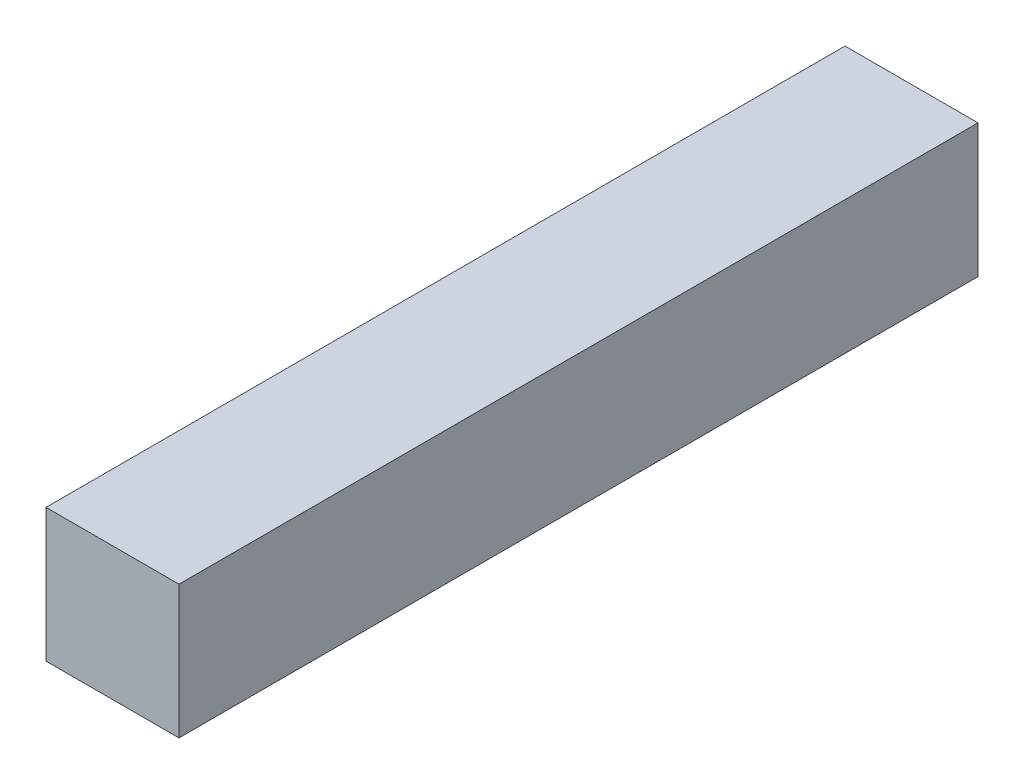
ISO-10303-21;
HEADER;
FILE_DESCRIPTION(('STEP AP214'),'2;1');
FILE_NAME('part.step','',(''),(''),'','','');
FILE_SCHEMA(('AUTOMOTIVE_DESIGN { 1 0 10303 214 1 1 1 1 }'));
ENDSEC;
DATA;
#1=APPLICATION_CONTEXT('core data for automotive mechanical design processes');
#2=APPLICATION_PROTOCOL_DEFINITION('international standard','automotive_design',2000,#1);
#3=PRODUCT_CONTEXT('',#1,'mechanical');
#4=PRODUCT('Part','Part','',(#3));
#5=PRODUCT_RELATED_PRODUCT_CATEGORY('part','',(#4));
#6=PRODUCT_DEFINITION_FORMATION('','',#4);
#7=PRODUCT_DEFINITION_CONTEXT('part definition',#1,'design');
#8=PRODUCT_DEFINITION('design','',#6,#7);
#9=PRODUCT_DEFINITION_SHAPE('','',#8);
#10=(LENGTH_UNIT() NAMED_UNIT(*) SI_UNIT(.MILLI.,.METRE.));
#11=(NAMED_UNIT(*) PLANE_ANGLE_UNIT() SI_UNIT($,.RADIAN.));
#12=(NAMED_UNIT(*) SI_UNIT($,.STERADIAN.) SOLID_ANGLE_UNIT());
#13=UNCERTAINTY_MEASURE_WITH_UNIT(LENGTH_MEASURE(1.E-05),#10,'distance_accuracy_value','');
#14=(GEOMETRIC_REPRESENTATION_CONTEXT(3) GLOBAL_UNCERTAINTY_ASSIGNED_CONTEXT((#13)) GLOBAL_UNIT_ASSIGNED_CONTEXT((#10,
#11,#12)) REPRESENTATION_CONTEXT('',''));
#15=CARTESIAN_POINT('',(0.,0.,0.));
#16=DIRECTION('',(0.,0.,1.));
#17=DIRECTION('',(1.,0.,0.));
#18=AXIS2_PLACEMENT_3D('',#15,#16,#17);
#19=CARTESIAN_POINT('',(-99.8810072223307,-100.,600.));
#20=DIRECTION('',(0.,1.,0.));
#21=DIRECTION('',(0.,0.,1.));
#22=AXIS2_PLACEMENT_3D('',#19,#20,#21);
#23=PLANE('',#22);
#24=DIRECTION('',(1.,0.,0.));
#25=VECTOR('',#24,1.);
#26=CARTESIAN_POINT('',(-99.8810072223307,-100.,0.));
#27=LINE('',#26,#25);
#28=CARTESIAN_POINT('',(-99.8810072223307,-100.,0.));
#29=VERTEX_POINT('',#28);
#30=CARTESIAN_POINT('',(0.,-100.,0.));
#31=VERTEX_POINT('',#30);
#32=EDGE_CURVE('E96',#29,#31,#27,.T.);
#33=ORIENTED_EDGE('',*,*,#32,.T.);
#34=DIRECTION('',(0.,0.,-1.));
#35=VECTOR('',#34,1.);
#36=CARTESIAN_POINT('',(0.,-100.,600.));
#37=LINE('',#36,#35);
#38=CARTESIAN_POINT('',(0.,-100.,600.));
#39=VERTEX_POINT('',#38);
#40=EDGE_CURVE('E11',#39,#31,#37,.T.);
#41=ORIENTED_EDGE('',*,*,#40,.F.);
#42=DIRECTION('',(1.,0.,0.));
#43=VECTOR('',#42,1.);
#44=CARTESIAN_POINT('',(-99.8810072223307,-100.,600.));
#45=LINE('',#44,#43);
#46=CARTESIAN_POINT('',(-99.8810072223307,-100.,600.));
#47=VERTEX_POINT('',#46);
#48=EDGE_CURVE('E84',#47,#39,#45,.T.);
#49=ORIENTED_EDGE('',*,*,#48,.F.);
#50=DIRECTION('',(0.,0.,-1.));
#51=VECTOR('',#50,1.);
#52=CARTESIAN_POINT('',(-99.8810072223307,-100.,600.));
#53=LINE('',#52,#51);
#54=EDGE_CURVE('E92',#47,#29,#53,.T.);
#55=ORIENTED_EDGE('',*,*,#54,.T.);
#56=EDGE_LOOP('',(#33,#41,#49,#55));
#57=FACE_BOUND('',#56,.T.);
#58=ADVANCED_FACE('F33',(#57),#23,.F.);
#59=CARTESIAN_POINT('',(0.,-100.,600.));
#60=DIRECTION('',(-1.,0.,0.));
#61=DIRECTION('',(0.,0.,1.));
#62=AXIS2_PLACEMENT_3D('',#59,#60,#61);
#63=PLANE('',#62);
#64=DIRECTION('',(0.,1.,0.));
#65=VECTOR('',#64,1.);
#66=CARTESIAN_POINT('',(0.,-100.,0.));
#67=LINE('',#66,#65);
#68=CARTESIAN_POINT('',(0.,0.,0.));
#69=VERTEX_POINT('',#68);
#70=EDGE_CURVE('E88',#31,#69,#67,.T.);
#71=ORIENTED_EDGE('',*,*,#70,.T.);
#72=DIRECTION('',(0.,0.,-1.));
#73=VECTOR('',#72,1.);
#74=CARTESIAN_POINT('',(0.,0.,600.));
#75=LINE('',#74,#73);
#76=CARTESIAN_POINT('',(0.,0.,600.));
#77=VERTEX_POINT('',#76);
#78=EDGE_CURVE('E41',#77,#69,#75,.T.);
#79=ORIENTED_EDGE('',*,*,#78,.F.);
#80=DIRECTION('',(0.,1.,0.));
#81=VECTOR('',#80,1.);
#82=CARTESIAN_POINT('',(0.,-100.,600.));
#83=LINE('',#82,#81);
#84=EDGE_CURVE('E79',#39,#77,#83,.T.);
#85=ORIENTED_EDGE('',*,*,#84,.F.);
#86=ORIENTED_EDGE('',*,*,#40,.T.);
#87=EDGE_LOOP('',(#71,#79,#85,#86));
#88=FACE_BOUND('',#87,.T.);
#89=ADVANCED_FACE('F87',(#88),#63,.F.);
#90=CARTESIAN_POINT('',(0.,0.,600.));
#91=DIRECTION('',(0.,-1.,0.));
#92=DIRECTION('',(1.,0.,0.));
#93=AXIS2_PLACEMENT_3D('',#90,#91,#92);
#94=PLANE('',#93);
#95=DIRECTION('',(-1.,0.,0.));
#96=VECTOR('',#95,1.);
#97=CARTESIAN_POINT('',(0.,0.,0.));
#98=LINE('',#97,#96);
#99=CARTESIAN_POINT('',(-99.8810072223307,0.,0.));
#100=VERTEX_POINT('',#99);
#101=EDGE_CURVE('E66',#69,#100,#98,.T.);
#102=ORIENTED_EDGE('',*,*,#101,.T.);
#103=DIRECTION('',(0.,0.,-1.));
#104=VECTOR('',#103,1.);
#105=CARTESIAN_POINT('',(-99.8810072223307,0.,600.));
#106=LINE('',#105,#104);
#107=CARTESIAN_POINT('',(-99.8810072223307,0.,600.));
#108=VERTEX_POINT('',#107);
#109=EDGE_CURVE('E89',#108,#100,#106,.T.);
#110=ORIENTED_EDGE('',*,*,#109,.F.);
#111=DIRECTION('',(-1.,0.,0.));
#112=VECTOR('',#111,1.);
#113=CARTESIAN_POINT('',(0.,0.,600.));
#114=LINE('',#113,#112);
#115=EDGE_CURVE('E82',#77,#108,#114,.T.);
#116=ORIENTED_EDGE('',*,*,#115,.F.);
#117=ORIENTED_EDGE('',*,*,#78,.T.);
#118=EDGE_LOOP('',(#102,#110,#116,#117));
#119=FACE_BOUND('',#118,.T.);
#120=ADVANCED_FACE('F90',(#119),#94,.F.);
#121=CARTESIAN_POINT('',(-99.8810072223307,0.,600.));
#122=DIRECTION('',(1.,0.,0.));
#123=DIRECTION('',(0.,1.,0.));
#124=AXIS2_PLACEMENT_3D('',#121,#122,#123);
#125=PLANE('',#124);
#126=DIRECTION('',(0.,-1.,0.));
#127=VECTOR('',#126,1.);
#128=CARTESIAN_POINT('',(-99.8810072223307,0.,0.));
#129=LINE('',#128,#127);
#130=EDGE_CURVE('E72',#100,#29,#129,.T.);
#131=ORIENTED_EDGE('',*,*,#130,.T.);
#132=ORIENTED_EDGE('',*,*,#54,.F.);
#133=DIRECTION('',(0.,-1.,0.));
#134=VECTOR('',#133,1.);
#135=CARTESIAN_POINT('',(-99.8810072223307,0.,600.));
#136=LINE('',#135,#134);
#137=EDGE_CURVE('E49',#108,#47,#136,.T.);
#138=ORIENTED_EDGE('',*,*,#137,.F.);
#139=ORIENTED_EDGE('',*,*,#109,.T.);
#140=EDGE_LOOP('',(#131,#132,#138,#139));
#141=FACE_BOUND('',#140,.T.);
#142=ADVANCED_FACE('F103',(#141),#125,.F.);
#143=CARTESIAN_POINT('',(0.,0.,600.));
#144=DIRECTION('',(0.,0.,1.));
#145=DIRECTION('',(1.,0.,0.));
#146=AXIS2_PLACEMENT_3D('',#143,#144,#145);
#147=PLANE('',#146);
#148=ORIENTED_EDGE('',*,*,#48,.T.);
#149=ORIENTED_EDGE('',*,*,#84,.T.);
#150=ORIENTED_EDGE('',*,*,#115,.T.);
#151=ORIENTED_EDGE('',*,*,#137,.T.);
#152=EDGE_LOOP('',(#148,#149,#150,#151));
#153=FACE_BOUND('',#152,.T.);
#154=ADVANCED_FACE('F80',(#153),#147,.T.);
#155=CARTESIAN_POINT('',(0.,0.,0.));
#156=DIRECTION('',(0.,0.,1.));
#157=DIRECTION('',(1.,0.,0.));
#158=AXIS2_PLACEMENT_3D('',#155,#156,#157);
#159=PLANE('',#158);
#160=ORIENTED_EDGE('',*,*,#32,.F.);
#161=ORIENTED_EDGE('',*,*,#130,.F.);
#162=ORIENTED_EDGE('',*,*,#101,.F.);
#163=ORIENTED_EDGE('',*,*,#70,.F.);
#164=EDGE_LOOP('',(#160,#161,#162,#163));
#165=FACE_BOUND('',#164,.T.);
#166=ADVANCED_FACE('F106',(#165),#159,.F.);
#167=CLOSED_SHELL('',(#58,#89,#120,#142,#154,#166));
#168=MANIFOLD_SOLID_BREP('B2',#167);
#169=ADVANCED_BREP_SHAPE_REPRESENTATION('',(#18,#168),#14);
#170=SHAPE_DEFINITION_REPRESENTATION(#9,#169);
ENDSEC;
END-ISO-10303-21;
